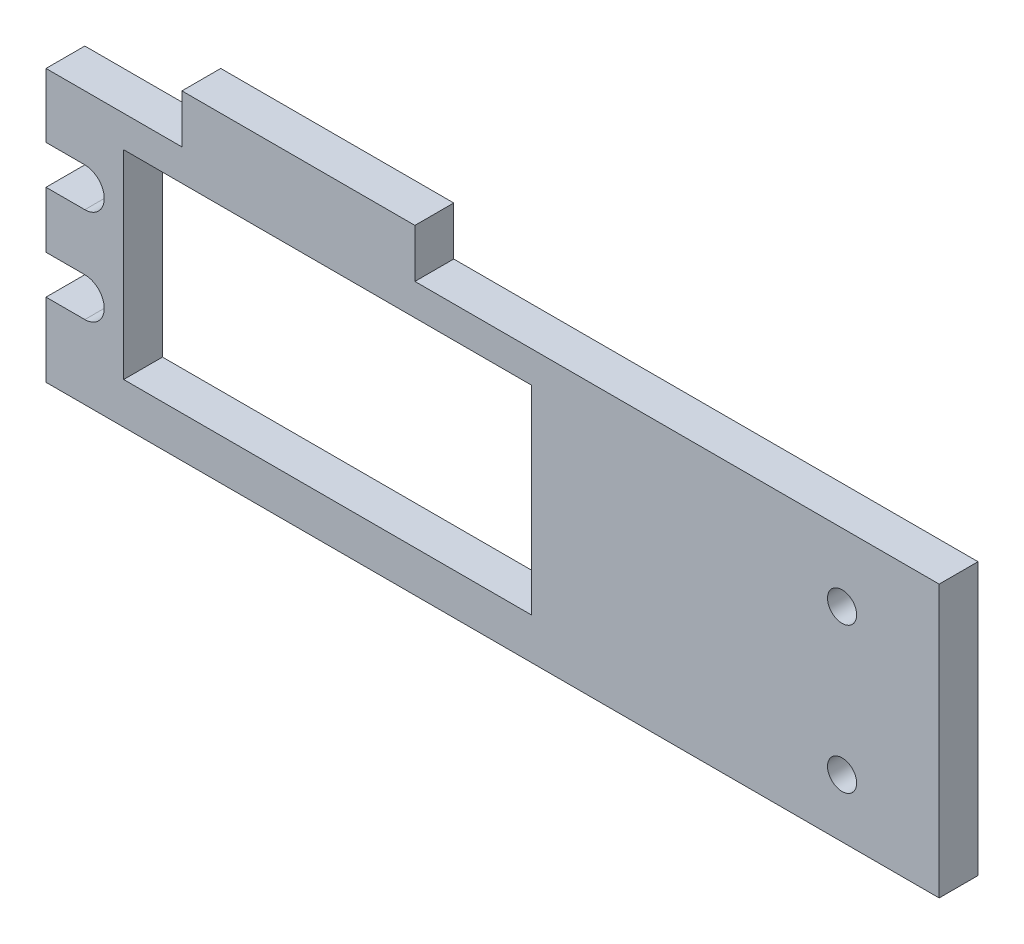
ISO-10303-21;
HEADER;
FILE_DESCRIPTION(('STEP AP214'),'2;1');
FILE_NAME('part.step','',(''),(''),'','','');
FILE_SCHEMA(('AUTOMOTIVE_DESIGN { 1 0 10303 214 1 1 1 1 }'));
ENDSEC;
DATA;
#1=APPLICATION_CONTEXT('core data for automotive mechanical design processes');
#2=APPLICATION_PROTOCOL_DEFINITION('international standard','automotive_design',2000,#1);
#3=PRODUCT_CONTEXT('',#1,'mechanical');
#4=PRODUCT('Part','Part','',(#3));
#5=PRODUCT_RELATED_PRODUCT_CATEGORY('part','',(#4));
#6=PRODUCT_DEFINITION_FORMATION('','',#4);
#7=PRODUCT_DEFINITION_CONTEXT('part definition',#1,'design');
#8=PRODUCT_DEFINITION('design','',#6,#7);
#9=PRODUCT_DEFINITION_SHAPE('','',#8);
#10=(LENGTH_UNIT() NAMED_UNIT(*) SI_UNIT(.MILLI.,.METRE.));
#11=(NAMED_UNIT(*) PLANE_ANGLE_UNIT() SI_UNIT($,.RADIAN.));
#12=(NAMED_UNIT(*) SI_UNIT($,.STERADIAN.) SOLID_ANGLE_UNIT());
#13=UNCERTAINTY_MEASURE_WITH_UNIT(LENGTH_MEASURE(1.E-05),#10,'distance_accuracy_value','');
#14=(GEOMETRIC_REPRESENTATION_CONTEXT(3) GLOBAL_UNCERTAINTY_ASSIGNED_CONTEXT((#13)) GLOBAL_UNIT_ASSIGNED_CONTEXT((#10,
#11,#12)) REPRESENTATION_CONTEXT('',''));
#15=CARTESIAN_POINT('',(0.,0.,0.));
#16=DIRECTION('',(0.,0.,1.));
#17=DIRECTION('',(1.,0.,0.));
#18=AXIS2_PLACEMENT_3D('',#15,#16,#17);
#19=CARTESIAN_POINT('',(-88.,19.4,4.));
#20=DIRECTION('',(0.,0.,-1.));
#21=DIRECTION('',(-1.,0.,0.));
#22=AXIS2_PLACEMENT_3D('',#19,#20,#21);
#23=PLANE('',#22);
#24=DIRECTION('',(1.,0.,0.));
#25=VECTOR('',#24,1.);
#26=CARTESIAN_POINT('',(0.,24.75,4.));
#27=LINE('',#26,#25);
#28=CARTESIAN_POINT('',(-84.,24.75,4.));
#29=VERTEX_POINT('',#28);
#30=CARTESIAN_POINT('',(-42.,24.75,4.));
#31=VERTEX_POINT('',#30);
#32=EDGE_CURVE('E337',#29,#31,#27,.T.);
#33=ORIENTED_EDGE('',*,*,#32,.T.);
#34=DIRECTION('',(0.,-1.,0.));
#35=VECTOR('',#34,1.);
#36=CARTESIAN_POINT('',(-42.,0.,4.));
#37=LINE('',#36,#35);
#38=CARTESIAN_POINT('',(-42.,4.25,4.));
#39=VERTEX_POINT('',#38);
#40=EDGE_CURVE('E345',#31,#39,#37,.T.);
#41=ORIENTED_EDGE('',*,*,#40,.T.);
#42=DIRECTION('',(1.,0.,0.));
#43=VECTOR('',#42,1.);
#44=CARTESIAN_POINT('',(0.,4.25,4.));
#45=LINE('',#44,#43);
#46=CARTESIAN_POINT('',(-84.,4.25,4.));
#47=VERTEX_POINT('',#46);
#48=EDGE_CURVE('E355',#47,#39,#45,.T.);
#49=ORIENTED_EDGE('',*,*,#48,.F.);
#50=DIRECTION('',(0.,-1.,0.));
#51=VECTOR('',#50,1.);
#52=CARTESIAN_POINT('',(-84.,0.,4.));
#53=LINE('',#52,#51);
#54=EDGE_CURVE('E353',#29,#47,#53,.T.);
#55=ORIENTED_EDGE('',*,*,#54,.F.);
#56=EDGE_LOOP('',(#33,#41,#49,#55));
#57=FACE_BOUND('',#56,.T.);
#58=DIRECTION('',(0.,1.,0.));
#59=VECTOR('',#58,1.);
#60=CARTESIAN_POINT('',(0.,0.,4.));
#61=LINE('',#60,#59);
#62=CARTESIAN_POINT('',(0.,0.,4.));
#63=VERTEX_POINT('',#62);
#64=CARTESIAN_POINT('',(0.,28.,4.));
#65=VERTEX_POINT('',#64);
#66=EDGE_CURVE('E371',#63,#65,#61,.T.);
#67=ORIENTED_EDGE('',*,*,#66,.T.);
#68=DIRECTION('',(-1.,0.,0.));
#69=VECTOR('',#68,1.);
#70=CARTESIAN_POINT('',(0.,28.,4.));
#71=LINE('',#70,#69);
#72=CARTESIAN_POINT('',(-54.,28.,4.));
#73=VERTEX_POINT('',#72);
#74=EDGE_CURVE('E374',#65,#73,#71,.T.);
#75=ORIENTED_EDGE('',*,*,#74,.T.);
#76=DIRECTION('',(0.,-1.,0.));
#77=VECTOR('',#76,1.);
#78=CARTESIAN_POINT('',(-54.,33.,4.));
#79=LINE('',#78,#77);
#80=CARTESIAN_POINT('',(-54.,33.,4.));
#81=VERTEX_POINT('',#80);
#82=EDGE_CURVE('E377',#81,#73,#79,.T.);
#83=ORIENTED_EDGE('',*,*,#82,.F.);
#84=DIRECTION('',(1.,0.,0.));
#85=VECTOR('',#84,1.);
#86=CARTESIAN_POINT('',(-78.,33.,4.));
#87=LINE('',#86,#85);
#88=CARTESIAN_POINT('',(-78.,33.,4.));
#89=VERTEX_POINT('',#88);
#90=EDGE_CURVE('E380',#89,#81,#87,.T.);
#91=ORIENTED_EDGE('',*,*,#90,.F.);
#92=DIRECTION('',(0.,1.,0.));
#93=VECTOR('',#92,1.);
#94=CARTESIAN_POINT('',(-78.,28.,4.));
#95=LINE('',#94,#93);
#96=CARTESIAN_POINT('',(-78.,28.,4.));
#97=VERTEX_POINT('',#96);
#98=EDGE_CURVE('E383',#97,#89,#95,.T.);
#99=ORIENTED_EDGE('',*,*,#98,.F.);
#100=DIRECTION('',(-1.,0.,0.));
#101=VECTOR('',#100,1.);
#102=CARTESIAN_POINT('',(-78.,28.,4.));
#103=LINE('',#102,#101);
#104=CARTESIAN_POINT('',(-92.,28.,4.));
#105=VERTEX_POINT('',#104);
#106=EDGE_CURVE('E386',#97,#105,#103,.T.);
#107=ORIENTED_EDGE('',*,*,#106,.T.);
#108=DIRECTION('',(0.,-1.,0.));
#109=VECTOR('',#108,1.);
#110=CARTESIAN_POINT('',(-92.,28.,4.));
#111=LINE('',#110,#109);
#112=CARTESIAN_POINT('',(-92.,21.4,4.));
#113=VERTEX_POINT('',#112);
#114=EDGE_CURVE('E388',#105,#113,#111,.T.);
#115=ORIENTED_EDGE('',*,*,#114,.T.);
#116=DIRECTION('',(1.,0.,0.));
#117=VECTOR('',#116,1.);
#118=CARTESIAN_POINT('',(-92.,21.4,4.));
#119=LINE('',#118,#117);
#120=CARTESIAN_POINT('',(-88.,21.4,4.));
#121=VERTEX_POINT('',#120);
#122=EDGE_CURVE('E390',#113,#121,#119,.T.);
#123=ORIENTED_EDGE('',*,*,#122,.T.);
#124=CARTESIAN_POINT('',(-88.,19.4,4.));
#125=DIRECTION('',(0.,0.,-1.));
#126=DIRECTION('',(-1.,0.,0.));
#127=AXIS2_PLACEMENT_3D('',#124,#125,#126);
#128=CIRCLE('',#127,2.);
#129=CARTESIAN_POINT('',(-88.,17.4,4.));
#130=VERTEX_POINT('',#129);
#131=EDGE_CURVE('E392',#121,#130,#128,.T.);
#132=ORIENTED_EDGE('',*,*,#131,.T.);
#133=DIRECTION('',(1.,0.,0.));
#134=VECTOR('',#133,1.);
#135=CARTESIAN_POINT('',(-92.,17.4,4.));
#136=LINE('',#135,#134);
#137=CARTESIAN_POINT('',(-92.,17.4,4.));
#138=VERTEX_POINT('',#137);
#139=EDGE_CURVE('E394',#138,#130,#136,.T.);
#140=ORIENTED_EDGE('',*,*,#139,.F.);
#141=DIRECTION('',(0.,-1.,0.));
#142=VECTOR('',#141,1.);
#143=CARTESIAN_POINT('',(-92.,17.4,4.));
#144=LINE('',#143,#142);
#145=CARTESIAN_POINT('',(-92.,11.6,4.));
#146=VERTEX_POINT('',#145);
#147=EDGE_CURVE('E397',#138,#146,#144,.T.);
#148=ORIENTED_EDGE('',*,*,#147,.T.);
#149=DIRECTION('',(1.,0.,0.));
#150=VECTOR('',#149,1.);
#151=CARTESIAN_POINT('',(-92.,11.6,4.));
#152=LINE('',#151,#150);
#153=CARTESIAN_POINT('',(-88.,11.6,4.));
#154=VERTEX_POINT('',#153);
#155=EDGE_CURVE('E399',#146,#154,#152,.T.);
#156=ORIENTED_EDGE('',*,*,#155,.T.);
#157=CARTESIAN_POINT('',(-88.,9.6,4.));
#158=DIRECTION('',(0.,0.,-1.));
#159=DIRECTION('',(-1.,0.,0.));
#160=AXIS2_PLACEMENT_3D('',#157,#158,#159);
#161=CIRCLE('',#160,2.);
#162=CARTESIAN_POINT('',(-88.,7.6,4.));
#163=VERTEX_POINT('',#162);
#164=EDGE_CURVE('E401',#154,#163,#161,.T.);
#165=ORIENTED_EDGE('',*,*,#164,.T.);
#166=DIRECTION('',(-1.,0.,0.));
#167=VECTOR('',#166,1.);
#168=CARTESIAN_POINT('',(-88.,7.6,4.));
#169=LINE('',#168,#167);
#170=CARTESIAN_POINT('',(-92.,7.6,4.));
#171=VERTEX_POINT('',#170);
#172=EDGE_CURVE('E403',#163,#171,#169,.T.);
#173=ORIENTED_EDGE('',*,*,#172,.T.);
#174=DIRECTION('',(0.,-1.,0.));
#175=VECTOR('',#174,1.);
#176=CARTESIAN_POINT('',(-92.,7.6,4.));
#177=LINE('',#176,#175);
#178=CARTESIAN_POINT('',(-92.,0.,4.));
#179=VERTEX_POINT('',#178);
#180=EDGE_CURVE('E405',#171,#179,#177,.T.);
#181=ORIENTED_EDGE('',*,*,#180,.T.);
#182=DIRECTION('',(1.,0.,0.));
#183=VECTOR('',#182,1.);
#184=CARTESIAN_POINT('',(-92.,0.,4.));
#185=LINE('',#184,#183);
#186=EDGE_CURVE('E407',#179,#63,#185,.T.);
#187=ORIENTED_EDGE('',*,*,#186,.T.);
#188=EDGE_LOOP('',(#67,#75,#83,#91,#99,#107,#115,#123,#132,#140,#148,#156,#165,#173,#181,#187));
#189=FACE_BOUND('',#188,.T.);
#190=CARTESIAN_POINT('',(-9.99999999999999,21.,4.));
#191=DIRECTION('',(0.,0.,1.));
#192=DIRECTION('',(1.,0.,0.));
#193=AXIS2_PLACEMENT_3D('',#190,#191,#192);
#194=CIRCLE('',#193,1.5);
#195=CARTESIAN_POINT('',(-8.49999999999999,21.,4.));
#196=VERTEX_POINT('',#195);
#197=EDGE_CURVE('E361',#196,#196,#194,.T.);
#198=ORIENTED_EDGE('',*,*,#197,.F.);
#199=EDGE_LOOP('',(#198));
#200=FACE_BOUND('',#199,.T.);
#201=CARTESIAN_POINT('',(-9.99999999999999,6.,4.));
#202=DIRECTION('',(0.,0.,1.));
#203=DIRECTION('',(1.,0.,0.));
#204=AXIS2_PLACEMENT_3D('',#201,#202,#203);
#205=CIRCLE('',#204,1.5);
#206=CARTESIAN_POINT('',(-8.5,6.,4.));
#207=VERTEX_POINT('',#206);
#208=EDGE_CURVE('E772',#207,#207,#205,.T.);
#209=ORIENTED_EDGE('',*,*,#208,.F.);
#210=EDGE_LOOP('',(#209));
#211=FACE_BOUND('',#210,.T.);
#212=ADVANCED_FACE('F195',(#57,#189,#200,#211),#23,.F.);
#213=CARTESIAN_POINT('',(-88.,19.4,0.));
#214=DIRECTION('',(0.,0.,-1.));
#215=DIRECTION('',(-1.,0.,0.));
#216=AXIS2_PLACEMENT_3D('',#213,#214,#215);
#217=PLANE('',#216);
#218=CARTESIAN_POINT('',(-9.99999999999999,21.,0.));
#219=DIRECTION('',(0.,0.,1.));
#220=DIRECTION('',(1.,0.,0.));
#221=AXIS2_PLACEMENT_3D('',#218,#219,#220);
#222=CIRCLE('',#221,1.5);
#223=CARTESIAN_POINT('',(-8.49999999999999,21.,0.));
#224=VERTEX_POINT('',#223);
#225=EDGE_CURVE('E777',#224,#224,#222,.T.);
#226=ORIENTED_EDGE('',*,*,#225,.T.);
#227=EDGE_LOOP('',(#226));
#228=FACE_BOUND('',#227,.T.);
#229=DIRECTION('',(0.,-1.,0.));
#230=VECTOR('',#229,1.);
#231=CARTESIAN_POINT('',(-42.,0.,0.));
#232=LINE('',#231,#230);
#233=CARTESIAN_POINT('',(-42.,24.75,0.));
#234=VERTEX_POINT('',#233);
#235=CARTESIAN_POINT('',(-42.,4.25,0.));
#236=VERTEX_POINT('',#235);
#237=EDGE_CURVE('E218',#234,#236,#232,.T.);
#238=ORIENTED_EDGE('',*,*,#237,.F.);
#239=DIRECTION('',(1.,0.,0.));
#240=VECTOR('',#239,1.);
#241=CARTESIAN_POINT('',(0.,24.75,0.));
#242=LINE('',#241,#240);
#243=CARTESIAN_POINT('',(-84.,24.75,0.));
#244=VERTEX_POINT('',#243);
#245=EDGE_CURVE('E340',#244,#234,#242,.T.);
#246=ORIENTED_EDGE('',*,*,#245,.F.);
#247=DIRECTION('',(0.,-1.,0.));
#248=VECTOR('',#247,1.);
#249=CARTESIAN_POINT('',(-84.,0.,0.));
#250=LINE('',#249,#248);
#251=CARTESIAN_POINT('',(-84.,4.25,0.));
#252=VERTEX_POINT('',#251);
#253=EDGE_CURVE('E363',#244,#252,#250,.T.);
#254=ORIENTED_EDGE('',*,*,#253,.T.);
#255=DIRECTION('',(1.,0.,0.));
#256=VECTOR('',#255,1.);
#257=CARTESIAN_POINT('',(0.,4.25,0.));
#258=LINE('',#257,#256);
#259=EDGE_CURVE('E350',#252,#236,#258,.T.);
#260=ORIENTED_EDGE('',*,*,#259,.T.);
#261=EDGE_LOOP('',(#238,#246,#254,#260));
#262=FACE_BOUND('',#261,.T.);
#263=DIRECTION('',(0.,1.,0.));
#264=VECTOR('',#263,1.);
#265=CARTESIAN_POINT('',(0.,0.,0.));
#266=LINE('',#265,#264);
#267=CARTESIAN_POINT('',(0.,0.,0.));
#268=VERTEX_POINT('',#267);
#269=CARTESIAN_POINT('',(0.,28.,0.));
#270=VERTEX_POINT('',#269);
#271=EDGE_CURVE('E341',#268,#270,#266,.T.);
#272=ORIENTED_EDGE('',*,*,#271,.F.);
#273=DIRECTION('',(1.,0.,0.));
#274=VECTOR('',#273,1.);
#275=CARTESIAN_POINT('',(-92.,0.,0.));
#276=LINE('',#275,#274);
#277=CARTESIAN_POINT('',(-92.,0.,0.));
#278=VERTEX_POINT('',#277);
#279=EDGE_CURVE('E375',#278,#268,#276,.T.);
#280=ORIENTED_EDGE('',*,*,#279,.F.);
#281=DIRECTION('',(0.,-1.,0.));
#282=VECTOR('',#281,1.);
#283=CARTESIAN_POINT('',(-92.,7.6,0.));
#284=LINE('',#283,#282);
#285=CARTESIAN_POINT('',(-92.,7.6,0.));
#286=VERTEX_POINT('',#285);
#287=EDGE_CURVE('E444',#286,#278,#284,.T.);
#288=ORIENTED_EDGE('',*,*,#287,.F.);
#289=DIRECTION('',(-1.,0.,0.));
#290=VECTOR('',#289,1.);
#291=CARTESIAN_POINT('',(-88.,7.6,0.));
#292=LINE('',#291,#290);
#293=CARTESIAN_POINT('',(-88.,7.6,0.));
#294=VERTEX_POINT('',#293);
#295=EDGE_CURVE('E442',#294,#286,#292,.T.);
#296=ORIENTED_EDGE('',*,*,#295,.F.);
#297=CARTESIAN_POINT('',(-88.,9.6,0.));
#298=DIRECTION('',(0.,0.,-1.));
#299=DIRECTION('',(-1.,0.,0.));
#300=AXIS2_PLACEMENT_3D('',#297,#298,#299);
#301=CIRCLE('',#300,2.);
#302=CARTESIAN_POINT('',(-88.,11.6,0.));
#303=VERTEX_POINT('',#302);
#304=EDGE_CURVE('E440',#303,#294,#301,.T.);
#305=ORIENTED_EDGE('',*,*,#304,.F.);
#306=DIRECTION('',(1.,0.,0.));
#307=VECTOR('',#306,1.);
#308=CARTESIAN_POINT('',(-92.,11.6,0.));
#309=LINE('',#308,#307);
#310=CARTESIAN_POINT('',(-92.,11.6,0.));
#311=VERTEX_POINT('',#310);
#312=EDGE_CURVE('E438',#311,#303,#309,.T.);
#313=ORIENTED_EDGE('',*,*,#312,.F.);
#314=DIRECTION('',(0.,-1.,0.));
#315=VECTOR('',#314,1.);
#316=CARTESIAN_POINT('',(-92.,17.4,0.));
#317=LINE('',#316,#315);
#318=CARTESIAN_POINT('',(-92.,17.4,0.));
#319=VERTEX_POINT('',#318);
#320=EDGE_CURVE('E436',#319,#311,#317,.T.);
#321=ORIENTED_EDGE('',*,*,#320,.F.);
#322=DIRECTION('',(1.,0.,0.));
#323=VECTOR('',#322,1.);
#324=CARTESIAN_POINT('',(-92.,17.4,0.));
#325=LINE('',#324,#323);
#326=CARTESIAN_POINT('',(-88.,17.4,0.));
#327=VERTEX_POINT('',#326);
#328=EDGE_CURVE('E433',#319,#327,#325,.T.);
#329=ORIENTED_EDGE('',*,*,#328,.T.);
#330=CARTESIAN_POINT('',(-88.,19.4,0.));
#331=DIRECTION('',(0.,0.,-1.));
#332=DIRECTION('',(-1.,0.,0.));
#333=AXIS2_PLACEMENT_3D('',#330,#331,#332);
#334=CIRCLE('',#333,2.);
#335=CARTESIAN_POINT('',(-88.,21.4,0.));
#336=VERTEX_POINT('',#335);
#337=EDGE_CURVE('E430',#336,#327,#334,.T.);
#338=ORIENTED_EDGE('',*,*,#337,.F.);
#339=DIRECTION('',(1.,0.,0.));
#340=VECTOR('',#339,1.);
#341=CARTESIAN_POINT('',(-92.,21.4,0.));
#342=LINE('',#341,#340);
#343=CARTESIAN_POINT('',(-92.,21.4,0.));
#344=VERTEX_POINT('',#343);
#345=EDGE_CURVE('E428',#344,#336,#342,.T.);
#346=ORIENTED_EDGE('',*,*,#345,.F.);
#347=DIRECTION('',(0.,-1.,0.));
#348=VECTOR('',#347,1.);
#349=CARTESIAN_POINT('',(-92.,28.,0.));
#350=LINE('',#349,#348);
#351=CARTESIAN_POINT('',(-92.,28.,0.));
#352=VERTEX_POINT('',#351);
#353=EDGE_CURVE('E426',#352,#344,#350,.T.);
#354=ORIENTED_EDGE('',*,*,#353,.F.);
#355=DIRECTION('',(-1.,0.,0.));
#356=VECTOR('',#355,1.);
#357=CARTESIAN_POINT('',(-78.,28.,0.));
#358=LINE('',#357,#356);
#359=CARTESIAN_POINT('',(-78.,28.,0.));
#360=VERTEX_POINT('',#359);
#361=EDGE_CURVE('E424',#360,#352,#358,.T.);
#362=ORIENTED_EDGE('',*,*,#361,.F.);
#363=DIRECTION('',(0.,1.,0.));
#364=VECTOR('',#363,1.);
#365=CARTESIAN_POINT('',(-78.,28.,0.));
#366=LINE('',#365,#364);
#367=CARTESIAN_POINT('',(-78.,33.,0.));
#368=VERTEX_POINT('',#367);
#369=EDGE_CURVE('E421',#360,#368,#366,.T.);
#370=ORIENTED_EDGE('',*,*,#369,.T.);
#371=DIRECTION('',(1.,0.,0.));
#372=VECTOR('',#371,1.);
#373=CARTESIAN_POINT('',(-78.,33.,0.));
#374=LINE('',#373,#372);
#375=CARTESIAN_POINT('',(-54.,33.,0.));
#376=VERTEX_POINT('',#375);
#377=EDGE_CURVE('E418',#368,#376,#374,.T.);
#378=ORIENTED_EDGE('',*,*,#377,.T.);
#379=DIRECTION('',(0.,-1.,0.));
#380=VECTOR('',#379,1.);
#381=CARTESIAN_POINT('',(-54.,33.,0.));
#382=LINE('',#381,#380);
#383=CARTESIAN_POINT('',(-54.,28.,0.));
#384=VERTEX_POINT('',#383);
#385=EDGE_CURVE('E415',#376,#384,#382,.T.);
#386=ORIENTED_EDGE('',*,*,#385,.T.);
#387=DIRECTION('',(-1.,0.,0.));
#388=VECTOR('',#387,1.);
#389=CARTESIAN_POINT('',(0.,28.,0.));
#390=LINE('',#389,#388);
#391=EDGE_CURVE('E412',#270,#384,#390,.T.);
#392=ORIENTED_EDGE('',*,*,#391,.F.);
#393=EDGE_LOOP('',(#272,#280,#288,#296,#305,#313,#321,#329,#338,#346,#354,#362,#370,#378,#386,#392));
#394=FACE_BOUND('',#393,.T.);
#395=CARTESIAN_POINT('',(-9.99999999999999,6.,0.));
#396=DIRECTION('',(0.,0.,1.));
#397=DIRECTION('',(1.,0.,0.));
#398=AXIS2_PLACEMENT_3D('',#395,#396,#397);
#399=CIRCLE('',#398,1.5);
#400=CARTESIAN_POINT('',(-8.5,6.,0.));
#401=VERTEX_POINT('',#400);
#402=EDGE_CURVE('E775',#401,#401,#399,.T.);
#403=ORIENTED_EDGE('',*,*,#402,.T.);
#404=EDGE_LOOP('',(#403));
#405=FACE_BOUND('',#404,.T.);
#406=ADVANCED_FACE('F492',(#228,#262,#394,#405),#217,.T.);
#407=CARTESIAN_POINT('',(0.,0.,4.));
#408=DIRECTION('',(-1.,0.,0.));
#409=DIRECTION('',(0.,0.,1.));
#410=AXIS2_PLACEMENT_3D('',#407,#408,#409);
#411=PLANE('',#410);
#412=ORIENTED_EDGE('',*,*,#271,.T.);
#413=DIRECTION('',(0.,0.,-1.));
#414=VECTOR('',#413,1.);
#415=CARTESIAN_POINT('',(0.,28.,4.));
#416=LINE('',#415,#414);
#417=EDGE_CURVE('E12',#65,#270,#416,.T.);
#418=ORIENTED_EDGE('',*,*,#417,.F.);
#419=ORIENTED_EDGE('',*,*,#66,.F.);
#420=DIRECTION('',(0.,0.,-1.));
#421=VECTOR('',#420,1.);
#422=CARTESIAN_POINT('',(0.,0.,4.));
#423=LINE('',#422,#421);
#424=EDGE_CURVE('E409',#63,#268,#423,.T.);
#425=ORIENTED_EDGE('',*,*,#424,.T.);
#426=EDGE_LOOP('',(#412,#418,#419,#425));
#427=FACE_BOUND('',#426,.T.);
#428=ADVANCED_FACE('F197',(#427),#411,.F.);
#429=CARTESIAN_POINT('',(0.,28.,4.));
#430=DIRECTION('',(0.,-1.,0.));
#431=DIRECTION('',(1.,0.,0.));
#432=AXIS2_PLACEMENT_3D('',#429,#430,#431);
#433=PLANE('',#432);
#434=ORIENTED_EDGE('',*,*,#391,.T.);
#435=DIRECTION('',(0.,0.,-1.));
#436=VECTOR('',#435,1.);
#437=CARTESIAN_POINT('',(-54.,28.,4.));
#438=LINE('',#437,#436);
#439=EDGE_CURVE('E203',#73,#384,#438,.T.);
#440=ORIENTED_EDGE('',*,*,#439,.F.);
#441=ORIENTED_EDGE('',*,*,#74,.F.);
#442=ORIENTED_EDGE('',*,*,#417,.T.);
#443=EDGE_LOOP('',(#434,#440,#441,#442));
#444=FACE_BOUND('',#443,.T.);
#445=ADVANCED_FACE('F488',(#444),#433,.F.);
#446=CARTESIAN_POINT('',(-54.,33.,4.));
#447=DIRECTION('',(1.,0.,0.));
#448=DIRECTION('',(0.,1.,0.));
#449=AXIS2_PLACEMENT_3D('',#446,#447,#448);
#450=PLANE('',#449);
#451=ORIENTED_EDGE('',*,*,#385,.F.);
#452=DIRECTION('',(0.,0.,-1.));
#453=VECTOR('',#452,1.);
#454=CARTESIAN_POINT('',(-54.,33.,4.));
#455=LINE('',#454,#453);
#456=EDGE_CURVE('E481',#81,#376,#455,.T.);
#457=ORIENTED_EDGE('',*,*,#456,.F.);
#458=ORIENTED_EDGE('',*,*,#82,.T.);
#459=ORIENTED_EDGE('',*,*,#439,.T.);
#460=EDGE_LOOP('',(#451,#457,#458,#459));
#461=FACE_BOUND('',#460,.T.);
#462=ADVANCED_FACE('F485',(#461),#450,.T.);
#463=CARTESIAN_POINT('',(-78.,33.,4.));
#464=DIRECTION('',(0.,1.,0.));
#465=DIRECTION('',(0.,0.,1.));
#466=AXIS2_PLACEMENT_3D('',#463,#464,#465);
#467=PLANE('',#466);
#468=ORIENTED_EDGE('',*,*,#377,.F.);
#469=DIRECTION('',(0.,0.,-1.));
#470=VECTOR('',#469,1.);
#471=CARTESIAN_POINT('',(-78.,33.,4.));
#472=LINE('',#471,#470);
#473=EDGE_CURVE('E479',#89,#368,#472,.T.);
#474=ORIENTED_EDGE('',*,*,#473,.F.);
#475=ORIENTED_EDGE('',*,*,#90,.T.);
#476=ORIENTED_EDGE('',*,*,#456,.T.);
#477=EDGE_LOOP('',(#468,#474,#475,#476));
#478=FACE_BOUND('',#477,.T.);
#479=ADVANCED_FACE('F498',(#478),#467,.T.);
#480=CARTESIAN_POINT('',(-78.,28.,4.));
#481=DIRECTION('',(-1.,0.,0.));
#482=DIRECTION('',(0.,-1.,0.));
#483=AXIS2_PLACEMENT_3D('',#480,#481,#482);
#484=PLANE('',#483);
#485=ORIENTED_EDGE('',*,*,#369,.F.);
#486=DIRECTION('',(0.,0.,-1.));
#487=VECTOR('',#486,1.);
#488=CARTESIAN_POINT('',(-78.,28.,4.));
#489=LINE('',#488,#487);
#490=EDGE_CURVE('E477',#97,#360,#489,.T.);
#491=ORIENTED_EDGE('',*,*,#490,.F.);
#492=ORIENTED_EDGE('',*,*,#98,.T.);
#493=ORIENTED_EDGE('',*,*,#473,.T.);
#494=EDGE_LOOP('',(#485,#491,#492,#493));
#495=FACE_BOUND('',#494,.T.);
#496=ADVANCED_FACE('F558',(#495),#484,.T.);
#497=CARTESIAN_POINT('',(-78.,28.,4.));
#498=DIRECTION('',(0.,-1.,0.));
#499=DIRECTION('',(0.,0.,-1.));
#500=AXIS2_PLACEMENT_3D('',#497,#498,#499);
#501=PLANE('',#500);
#502=ORIENTED_EDGE('',*,*,#361,.T.);
#503=DIRECTION('',(0.,0.,-1.));
#504=VECTOR('',#503,1.);
#505=CARTESIAN_POINT('',(-92.,28.,4.));
#506=LINE('',#505,#504);
#507=EDGE_CURVE('E474',#105,#352,#506,.T.);
#508=ORIENTED_EDGE('',*,*,#507,.F.);
#509=ORIENTED_EDGE('',*,*,#106,.F.);
#510=ORIENTED_EDGE('',*,*,#490,.T.);
#511=EDGE_LOOP('',(#502,#508,#509,#510));
#512=FACE_BOUND('',#511,.T.);
#513=ADVANCED_FACE('F556',(#512),#501,.F.);
#514=CARTESIAN_POINT('',(-92.,28.,4.));
#515=DIRECTION('',(1.,0.,0.));
#516=DIRECTION('',(0.,0.,-1.));
#517=AXIS2_PLACEMENT_3D('',#514,#515,#516);
#518=PLANE('',#517);
#519=ORIENTED_EDGE('',*,*,#353,.T.);
#520=DIRECTION('',(0.,0.,-1.));
#521=VECTOR('',#520,1.);
#522=CARTESIAN_POINT('',(-92.,21.4,4.));
#523=LINE('',#522,#521);
#524=EDGE_CURVE('E471',#113,#344,#523,.T.);
#525=ORIENTED_EDGE('',*,*,#524,.F.);
#526=ORIENTED_EDGE('',*,*,#114,.F.);
#527=ORIENTED_EDGE('',*,*,#507,.T.);
#528=EDGE_LOOP('',(#519,#525,#526,#527));
#529=FACE_BOUND('',#528,.T.);
#530=ADVANCED_FACE('F552',(#529),#518,.F.);
#531=CARTESIAN_POINT('',(-92.,21.4,4.));
#532=DIRECTION('',(0.,1.,0.));
#533=DIRECTION('',(-1.,0.,0.));
#534=AXIS2_PLACEMENT_3D('',#531,#532,#533);
#535=PLANE('',#534);
#536=ORIENTED_EDGE('',*,*,#345,.T.);
#537=DIRECTION('',(0.,0.,-1.));
#538=VECTOR('',#537,1.);
#539=CARTESIAN_POINT('',(-88.,21.4,4.));
#540=LINE('',#539,#538);
#541=EDGE_CURVE('E468',#121,#336,#540,.T.);
#542=ORIENTED_EDGE('',*,*,#541,.F.);
#543=ORIENTED_EDGE('',*,*,#122,.F.);
#544=ORIENTED_EDGE('',*,*,#524,.T.);
#545=EDGE_LOOP('',(#536,#542,#543,#544));
#546=FACE_BOUND('',#545,.T.);
#547=ADVANCED_FACE('F547',(#546),#535,.F.);
#548=CARTESIAN_POINT('',(-88.,19.4,4.));
#549=DIRECTION('',(0.,0.,-1.));
#550=DIRECTION('',(-1.,0.,0.));
#551=AXIS2_PLACEMENT_3D('',#548,#549,#550);
#552=CYLINDRICAL_SURFACE('',#551,2.);
#553=ORIENTED_EDGE('',*,*,#337,.T.);
#554=DIRECTION('',(0.,0.,-1.));
#555=VECTOR('',#554,1.);
#556=CARTESIAN_POINT('',(-88.,17.4,4.));
#557=LINE('',#556,#555);
#558=EDGE_CURVE('E466',#130,#327,#557,.T.);
#559=ORIENTED_EDGE('',*,*,#558,.F.);
#560=ORIENTED_EDGE('',*,*,#131,.F.);
#561=ORIENTED_EDGE('',*,*,#541,.T.);
#562=EDGE_LOOP('',(#553,#559,#560,#561));
#563=FACE_BOUND('',#562,.T.);
#564=ADVANCED_FACE('F542',(#563),#552,.F.);
#565=CARTESIAN_POINT('',(-92.,17.4,4.));
#566=DIRECTION('',(0.,1.,0.));
#567=DIRECTION('',(0.,0.,1.));
#568=AXIS2_PLACEMENT_3D('',#565,#566,#567);
#569=PLANE('',#568);
#570=ORIENTED_EDGE('',*,*,#328,.F.);
#571=DIRECTION('',(0.,0.,-1.));
#572=VECTOR('',#571,1.);
#573=CARTESIAN_POINT('',(-92.,17.4,4.));
#574=LINE('',#573,#572);
#575=EDGE_CURVE('E464',#138,#319,#574,.T.);
#576=ORIENTED_EDGE('',*,*,#575,.F.);
#577=ORIENTED_EDGE('',*,*,#139,.T.);
#578=ORIENTED_EDGE('',*,*,#558,.T.);
#579=EDGE_LOOP('',(#570,#576,#577,#578));
#580=FACE_BOUND('',#579,.T.);
#581=ADVANCED_FACE('F538',(#580),#569,.T.);
#582=CARTESIAN_POINT('',(-92.,17.4,4.));
#583=DIRECTION('',(1.,0.,0.));
#584=DIRECTION('',(0.,0.,-1.));
#585=AXIS2_PLACEMENT_3D('',#582,#583,#584);
#586=PLANE('',#585);
#587=ORIENTED_EDGE('',*,*,#320,.T.);
#588=DIRECTION('',(0.,0.,-1.));
#589=VECTOR('',#588,1.);
#590=CARTESIAN_POINT('',(-92.,11.6,4.));
#591=LINE('',#590,#589);
#592=EDGE_CURVE('E461',#146,#311,#591,.T.);
#593=ORIENTED_EDGE('',*,*,#592,.F.);
#594=ORIENTED_EDGE('',*,*,#147,.F.);
#595=ORIENTED_EDGE('',*,*,#575,.T.);
#596=EDGE_LOOP('',(#587,#593,#594,#595));
#597=FACE_BOUND('',#596,.T.);
#598=ADVANCED_FACE('F533',(#597),#586,.F.);
#599=CARTESIAN_POINT('',(-92.,11.6,4.));
#600=DIRECTION('',(0.,1.,0.));
#601=DIRECTION('',(0.,0.,1.));
#602=AXIS2_PLACEMENT_3D('',#599,#600,#601);
#603=PLANE('',#602);
#604=ORIENTED_EDGE('',*,*,#312,.T.);
#605=DIRECTION('',(0.,0.,-1.));
#606=VECTOR('',#605,1.);
#607=CARTESIAN_POINT('',(-88.,11.6,4.));
#608=LINE('',#607,#606);
#609=EDGE_CURVE('E458',#154,#303,#608,.T.);
#610=ORIENTED_EDGE('',*,*,#609,.F.);
#611=ORIENTED_EDGE('',*,*,#155,.F.);
#612=ORIENTED_EDGE('',*,*,#592,.T.);
#613=EDGE_LOOP('',(#604,#610,#611,#612));
#614=FACE_BOUND('',#613,.T.);
#615=ADVANCED_FACE('F529',(#614),#603,.F.);
#616=CARTESIAN_POINT('',(-88.,9.6,4.));
#617=DIRECTION('',(0.,0.,-1.));
#618=DIRECTION('',(-1.,0.,0.));
#619=AXIS2_PLACEMENT_3D('',#616,#617,#618);
#620=CYLINDRICAL_SURFACE('',#619,2.);
#621=ORIENTED_EDGE('',*,*,#304,.T.);
#622=DIRECTION('',(0.,0.,-1.));
#623=VECTOR('',#622,1.);
#624=CARTESIAN_POINT('',(-88.,7.6,4.));
#625=LINE('',#624,#623);
#626=EDGE_CURVE('E455',#163,#294,#625,.T.);
#627=ORIENTED_EDGE('',*,*,#626,.F.);
#628=ORIENTED_EDGE('',*,*,#164,.F.);
#629=ORIENTED_EDGE('',*,*,#609,.T.);
#630=EDGE_LOOP('',(#621,#627,#628,#629));
#631=FACE_BOUND('',#630,.T.);
#632=ADVANCED_FACE('F524',(#631),#620,.F.);
#633=CARTESIAN_POINT('',(-88.,7.6,4.));
#634=DIRECTION('',(0.,-1.,0.));
#635=DIRECTION('',(1.,0.,0.));
#636=AXIS2_PLACEMENT_3D('',#633,#634,#635);
#637=PLANE('',#636);
#638=ORIENTED_EDGE('',*,*,#295,.T.);
#639=DIRECTION('',(0.,0.,-1.));
#640=VECTOR('',#639,1.);
#641=CARTESIAN_POINT('',(-92.,7.6,4.));
#642=LINE('',#641,#640);
#643=EDGE_CURVE('E452',#171,#286,#642,.T.);
#644=ORIENTED_EDGE('',*,*,#643,.F.);
#645=ORIENTED_EDGE('',*,*,#172,.F.);
#646=ORIENTED_EDGE('',*,*,#626,.T.);
#647=EDGE_LOOP('',(#638,#644,#645,#646));
#648=FACE_BOUND('',#647,.T.);
#649=ADVANCED_FACE('F518',(#648),#637,.F.);
#650=CARTESIAN_POINT('',(-92.,7.6,4.));
#651=DIRECTION('',(1.,0.,0.));
#652=DIRECTION('',(0.,0.,-1.));
#653=AXIS2_PLACEMENT_3D('',#650,#651,#652);
#654=PLANE('',#653);
#655=ORIENTED_EDGE('',*,*,#287,.T.);
#656=DIRECTION('',(0.,0.,-1.));
#657=VECTOR('',#656,1.);
#658=CARTESIAN_POINT('',(-92.,0.,4.));
#659=LINE('',#658,#657);
#660=EDGE_CURVE('E449',#179,#278,#659,.T.);
#661=ORIENTED_EDGE('',*,*,#660,.F.);
#662=ORIENTED_EDGE('',*,*,#180,.F.);
#663=ORIENTED_EDGE('',*,*,#643,.T.);
#664=EDGE_LOOP('',(#655,#661,#662,#663));
#665=FACE_BOUND('',#664,.T.);
#666=ADVANCED_FACE('F514',(#665),#654,.F.);
#667=CARTESIAN_POINT('',(-92.,0.,4.));
#668=DIRECTION('',(0.,1.,0.));
#669=DIRECTION('',(0.,0.,1.));
#670=AXIS2_PLACEMENT_3D('',#667,#668,#669);
#671=PLANE('',#670);
#672=ORIENTED_EDGE('',*,*,#279,.T.);
#673=ORIENTED_EDGE('',*,*,#424,.F.);
#674=ORIENTED_EDGE('',*,*,#186,.F.);
#675=ORIENTED_EDGE('',*,*,#660,.T.);
#676=EDGE_LOOP('',(#672,#673,#674,#675));
#677=FACE_BOUND('',#676,.T.);
#678=ADVANCED_FACE('F510',(#677),#671,.F.);
#679=CARTESIAN_POINT('',(-42.,0.,4.));
#680=DIRECTION('',(1.,0.,0.));
#681=DIRECTION('',(0.,0.,-1.));
#682=AXIS2_PLACEMENT_3D('',#679,#680,#681);
#683=PLANE('',#682);
#684=ORIENTED_EDGE('',*,*,#237,.T.);
#685=DIRECTION('',(0.,0.,-1.));
#686=VECTOR('',#685,1.);
#687=CARTESIAN_POINT('',(-42.,4.25,4.));
#688=LINE('',#687,#686);
#689=EDGE_CURVE('E347',#39,#236,#688,.T.);
#690=ORIENTED_EDGE('',*,*,#689,.F.);
#691=ORIENTED_EDGE('',*,*,#40,.F.);
#692=DIRECTION('',(0.,0.,-1.));
#693=VECTOR('',#692,1.);
#694=CARTESIAN_POINT('',(-42.,24.75,4.));
#695=LINE('',#694,#693);
#696=EDGE_CURVE('E333',#31,#234,#695,.T.);
#697=ORIENTED_EDGE('',*,*,#696,.T.);
#698=EDGE_LOOP('',(#684,#690,#691,#697));
#699=FACE_BOUND('',#698,.T.);
#700=ADVANCED_FACE('F346',(#699),#683,.F.);
#701=CARTESIAN_POINT('',(0.,24.75,4.));
#702=DIRECTION('',(0.,1.,0.));
#703=DIRECTION('',(0.,0.,1.));
#704=AXIS2_PLACEMENT_3D('',#701,#702,#703);
#705=PLANE('',#704);
#706=ORIENTED_EDGE('',*,*,#245,.T.);
#707=ORIENTED_EDGE('',*,*,#696,.F.);
#708=ORIENTED_EDGE('',*,*,#32,.F.);
#709=DIRECTION('',(0.,0.,-1.));
#710=VECTOR('',#709,1.);
#711=CARTESIAN_POINT('',(-84.,24.75,4.));
#712=LINE('',#711,#710);
#713=EDGE_CURVE('E342',#29,#244,#712,.T.);
#714=ORIENTED_EDGE('',*,*,#713,.T.);
#715=EDGE_LOOP('',(#706,#707,#708,#714));
#716=FACE_BOUND('',#715,.T.);
#717=ADVANCED_FACE('F335',(#716),#705,.F.);
#718=CARTESIAN_POINT('',(-84.,0.,4.));
#719=DIRECTION('',(1.,0.,0.));
#720=DIRECTION('',(0.,0.,-1.));
#721=AXIS2_PLACEMENT_3D('',#718,#719,#720);
#722=PLANE('',#721);
#723=ORIENTED_EDGE('',*,*,#253,.F.);
#724=ORIENTED_EDGE('',*,*,#713,.F.);
#725=ORIENTED_EDGE('',*,*,#54,.T.);
#726=DIRECTION('',(0.,0.,-1.));
#727=VECTOR('',#726,1.);
#728=CARTESIAN_POINT('',(-84.,4.25,4.));
#729=LINE('',#728,#727);
#730=EDGE_CURVE('E210',#47,#252,#729,.T.);
#731=ORIENTED_EDGE('',*,*,#730,.T.);
#732=EDGE_LOOP('',(#723,#724,#725,#731));
#733=FACE_BOUND('',#732,.T.);
#734=ADVANCED_FACE('F647',(#733),#722,.T.);
#735=CARTESIAN_POINT('',(0.,4.25,4.));
#736=DIRECTION('',(0.,1.,0.));
#737=DIRECTION('',(0.,0.,1.));
#738=AXIS2_PLACEMENT_3D('',#735,#736,#737);
#739=PLANE('',#738);
#740=ORIENTED_EDGE('',*,*,#259,.F.);
#741=ORIENTED_EDGE('',*,*,#730,.F.);
#742=ORIENTED_EDGE('',*,*,#48,.T.);
#743=ORIENTED_EDGE('',*,*,#689,.T.);
#744=EDGE_LOOP('',(#740,#741,#742,#743));
#745=FACE_BOUND('',#744,.T.);
#746=ADVANCED_FACE('F653',(#745),#739,.T.);
#747=CARTESIAN_POINT('',(-9.99999999999999,21.,4.));
#748=DIRECTION('',(0.,0.,-1.));
#749=DIRECTION('',(-1.,0.,0.));
#750=AXIS2_PLACEMENT_3D('',#747,#748,#749);
#751=CYLINDRICAL_SURFACE('',#750,1.5);
#752=ORIENTED_EDGE('',*,*,#197,.T.);
#753=EDGE_LOOP('',(#752));
#754=FACE_BOUND('',#753,.T.);
#755=ORIENTED_EDGE('',*,*,#225,.F.);
#756=EDGE_LOOP('',(#755));
#757=FACE_BOUND('',#756,.T.);
#758=ADVANCED_FACE('F661',(#754,#757),#751,.F.);
#759=CARTESIAN_POINT('',(-9.99999999999999,6.,4.));
#760=DIRECTION('',(0.,0.,-1.));
#761=DIRECTION('',(-1.,0.,0.));
#762=AXIS2_PLACEMENT_3D('',#759,#760,#761);
#763=CYLINDRICAL_SURFACE('',#762,1.5);
#764=ORIENTED_EDGE('',*,*,#208,.T.);
#765=EDGE_LOOP('',(#764));
#766=FACE_BOUND('',#765,.T.);
#767=ORIENTED_EDGE('',*,*,#402,.F.);
#768=EDGE_LOOP('',(#767));
#769=FACE_BOUND('',#768,.T.);
#770=ADVANCED_FACE('F668',(#766,#769),#763,.F.);
#771=CLOSED_SHELL('',(#212,#406,#428,#445,#462,#479,#496,#513,#530,#547,#564,#581,#598,#615,
#632,#649,#666,#678,#700,#717,#734,#746,#758,#770));
#772=MANIFOLD_SOLID_BREP('B2',#771);
#773=ADVANCED_BREP_SHAPE_REPRESENTATION('',(#18,#772),#14);
#774=SHAPE_DEFINITION_REPRESENTATION(#9,#773);
ENDSEC;
END-ISO-10303-21;
